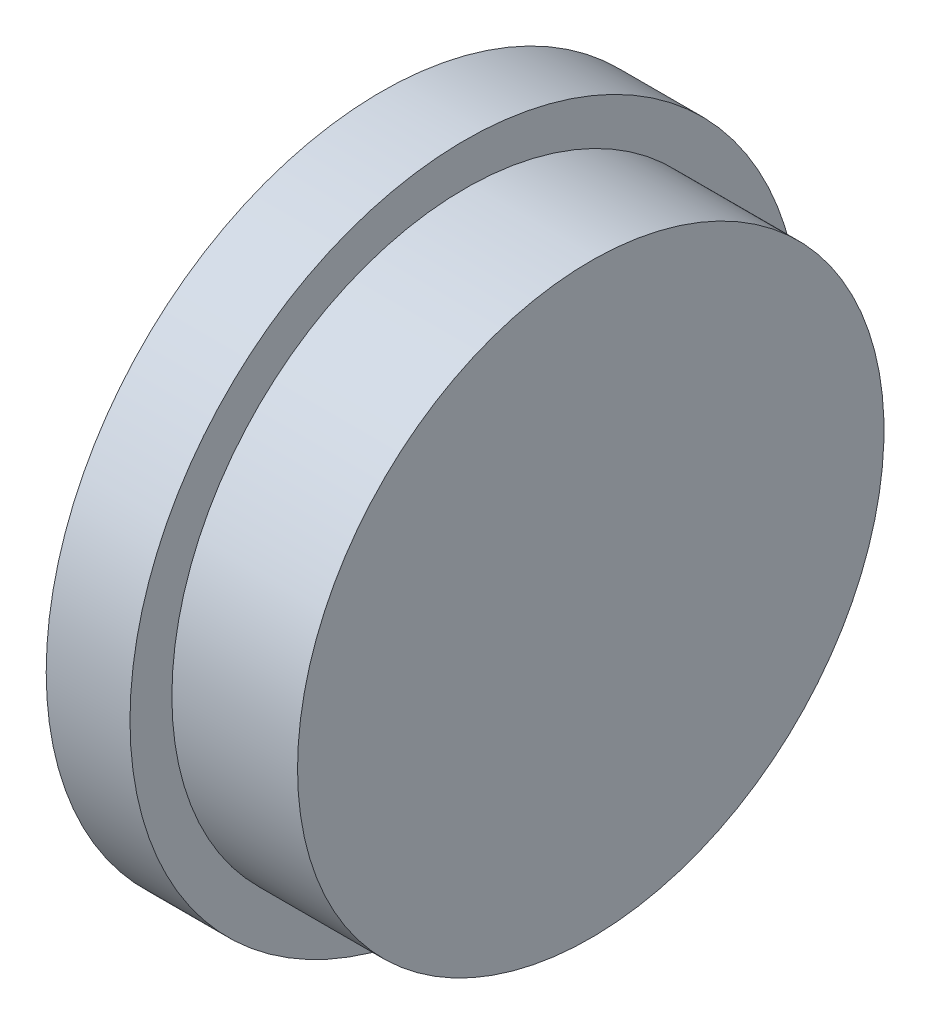
ISO-10303-21;
HEADER;
FILE_DESCRIPTION(('STEP AP214'),'2;1');
FILE_NAME('part.step','',(''),(''),'','','');
FILE_SCHEMA(('AUTOMOTIVE_DESIGN { 1 0 10303 214 1 1 1 1 }'));
ENDSEC;
DATA;
#1=APPLICATION_CONTEXT('core data for automotive mechanical design processes');
#2=APPLICATION_PROTOCOL_DEFINITION('international standard','automotive_design',2000,#1);
#3=PRODUCT_CONTEXT('',#1,'mechanical');
#4=PRODUCT('Part','Part','',(#3));
#5=PRODUCT_RELATED_PRODUCT_CATEGORY('part','',(#4));
#6=PRODUCT_DEFINITION_FORMATION('','',#4);
#7=PRODUCT_DEFINITION_CONTEXT('part definition',#1,'design');
#8=PRODUCT_DEFINITION('design','',#6,#7);
#9=PRODUCT_DEFINITION_SHAPE('','',#8);
#10=(LENGTH_UNIT() NAMED_UNIT(*) SI_UNIT(.MILLI.,.METRE.));
#11=(NAMED_UNIT(*) PLANE_ANGLE_UNIT() SI_UNIT($,.RADIAN.));
#12=(NAMED_UNIT(*) SI_UNIT($,.STERADIAN.) SOLID_ANGLE_UNIT());
#13=UNCERTAINTY_MEASURE_WITH_UNIT(LENGTH_MEASURE(1.E-05),#10,'distance_accuracy_value','');
#14=(GEOMETRIC_REPRESENTATION_CONTEXT(3) GLOBAL_UNCERTAINTY_ASSIGNED_CONTEXT((#13)) GLOBAL_UNIT_ASSIGNED_CONTEXT((#10,
#11,#12)) REPRESENTATION_CONTEXT('',''));
#15=CARTESIAN_POINT('',(0.,0.,0.));
#16=DIRECTION('',(0.,0.,1.));
#17=DIRECTION('',(1.,0.,0.));
#18=AXIS2_PLACEMENT_3D('',#15,#16,#17);
#19=CARTESIAN_POINT('',(15.,0.,0.));
#20=DIRECTION('',(-1.,0.,0.));
#21=DIRECTION('',(0.,0.,1.));
#22=AXIS2_PLACEMENT_3D('',#19,#20,#21);
#23=PLANE('',#22);
#24=CARTESIAN_POINT('',(15.,0.,0.));
#25=DIRECTION('',(-1.,0.,0.));
#26=DIRECTION('',(0.,0.,1.));
#27=AXIS2_PLACEMENT_3D('',#24,#25,#26);
#28=CIRCLE('',#27,21.);
#29=CARTESIAN_POINT('',(15.,0.,21.));
#30=VERTEX_POINT('',#29);
#31=EDGE_CURVE('E64',#30,#30,#28,.T.);
#32=ORIENTED_EDGE('',*,*,#31,.F.);
#33=EDGE_LOOP('',(#32));
#34=FACE_BOUND('',#33,.T.);
#35=ADVANCED_FACE('F37',(#34),#23,.F.);
#36=CARTESIAN_POINT('',(13.,0.,0.));
#37=DIRECTION('',(1.,0.,0.));
#38=DIRECTION('',(0.,0.,-1.));
#39=AXIS2_PLACEMENT_3D('',#36,#37,#38);
#40=PLANE('',#39);
#41=CARTESIAN_POINT('',(13.,0.,0.));
#42=DIRECTION('',(-1.,0.,0.));
#43=DIRECTION('',(0.,0.,1.));
#44=AXIS2_PLACEMENT_3D('',#41,#42,#43);
#45=CIRCLE('',#44,16.);
#46=CARTESIAN_POINT('',(13.,0.,16.));
#47=VERTEX_POINT('',#46);
#48=EDGE_CURVE('E10',#47,#47,#45,.T.);
#49=ORIENTED_EDGE('',*,*,#48,.T.);
#50=EDGE_LOOP('',(#49));
#51=FACE_BOUND('',#50,.T.);
#52=ADVANCED_FACE('F72',(#51),#40,.F.);
#53=CARTESIAN_POINT('',(0.,0.,0.));
#54=DIRECTION('',(-1.,0.,0.));
#55=DIRECTION('',(0.,0.,1.));
#56=AXIS2_PLACEMENT_3D('',#53,#54,#55);
#57=CYLINDRICAL_SURFACE('',#56,16.);
#58=ORIENTED_EDGE('',*,*,#48,.F.);
#59=EDGE_LOOP('',(#58));
#60=FACE_BOUND('',#59,.T.);
#61=CARTESIAN_POINT('',(0.,0.,0.));
#62=DIRECTION('',(-1.,0.,0.));
#63=DIRECTION('',(0.,0.,1.));
#64=AXIS2_PLACEMENT_3D('',#61,#62,#63);
#65=CIRCLE('',#64,16.);
#66=CARTESIAN_POINT('',(0.,0.,16.));
#67=VERTEX_POINT('',#66);
#68=EDGE_CURVE('E44',#67,#67,#65,.T.);
#69=ORIENTED_EDGE('',*,*,#68,.T.);
#70=EDGE_LOOP('',(#69));
#71=FACE_BOUND('',#70,.T.);
#72=ADVANCED_FACE('F76',(#60,#71),#57,.F.);
#73=CARTESIAN_POINT('',(0.,16.,0.));
#74=DIRECTION('',(1.,0.,0.));
#75=DIRECTION('',(0.,0.,-1.));
#76=AXIS2_PLACEMENT_3D('',#73,#74,#75);
#77=PLANE('',#76);
#78=ORIENTED_EDGE('',*,*,#68,.F.);
#79=EDGE_LOOP('',(#78));
#80=FACE_BOUND('',#79,.T.);
#81=CARTESIAN_POINT('',(0.,0.,0.));
#82=DIRECTION('',(-1.,0.,0.));
#83=DIRECTION('',(0.,0.,1.));
#84=AXIS2_PLACEMENT_3D('',#81,#82,#83);
#85=CIRCLE('',#84,24.);
#86=CARTESIAN_POINT('',(0.,0.,24.));
#87=VERTEX_POINT('',#86);
#88=EDGE_CURVE('E49',#87,#87,#85,.T.);
#89=ORIENTED_EDGE('',*,*,#88,.T.);
#90=EDGE_LOOP('',(#89));
#91=FACE_BOUND('',#90,.T.);
#92=ADVANCED_FACE('F80',(#80,#91),#77,.F.);
#93=CARTESIAN_POINT('',(0.,0.,0.));
#94=DIRECTION('',(-1.,0.,0.));
#95=DIRECTION('',(0.,0.,1.));
#96=AXIS2_PLACEMENT_3D('',#93,#94,#95);
#97=CYLINDRICAL_SURFACE('',#96,24.);
#98=ORIENTED_EDGE('',*,*,#88,.F.);
#99=EDGE_LOOP('',(#98));
#100=FACE_BOUND('',#99,.T.);
#101=CARTESIAN_POINT('',(6.,0.,0.));
#102=DIRECTION('',(-1.,0.,0.));
#103=DIRECTION('',(0.,0.,1.));
#104=AXIS2_PLACEMENT_3D('',#101,#102,#103);
#105=CIRCLE('',#104,24.);
#106=CARTESIAN_POINT('',(6.,0.,24.));
#107=VERTEX_POINT('',#106);
#108=EDGE_CURVE('E54',#107,#107,#105,.T.);
#109=ORIENTED_EDGE('',*,*,#108,.T.);
#110=EDGE_LOOP('',(#109));
#111=FACE_BOUND('',#110,.T.);
#112=ADVANCED_FACE('F86',(#100,#111),#97,.T.);
#113=CARTESIAN_POINT('',(6.,24.,0.));
#114=DIRECTION('',(-1.,0.,0.));
#115=DIRECTION('',(0.,0.,1.));
#116=AXIS2_PLACEMENT_3D('',#113,#114,#115);
#117=PLANE('',#116);
#118=ORIENTED_EDGE('',*,*,#108,.F.);
#119=EDGE_LOOP('',(#118));
#120=FACE_BOUND('',#119,.T.);
#121=CARTESIAN_POINT('',(6.,0.,0.));
#122=DIRECTION('',(-1.,0.,0.));
#123=DIRECTION('',(0.,0.,1.));
#124=AXIS2_PLACEMENT_3D('',#121,#122,#123);
#125=CIRCLE('',#124,21.);
#126=CARTESIAN_POINT('',(6.,0.,21.));
#127=VERTEX_POINT('',#126);
#128=EDGE_CURVE('E60',#127,#127,#125,.T.);
#129=ORIENTED_EDGE('',*,*,#128,.T.);
#130=EDGE_LOOP('',(#129));
#131=FACE_BOUND('',#130,.T.);
#132=ADVANCED_FACE('F90',(#120,#131),#117,.F.);
#133=CARTESIAN_POINT('',(0.,0.,0.));
#134=DIRECTION('',(-1.,0.,0.));
#135=DIRECTION('',(0.,0.,1.));
#136=AXIS2_PLACEMENT_3D('',#133,#134,#135);
#137=CYLINDRICAL_SURFACE('',#136,21.);
#138=ORIENTED_EDGE('',*,*,#128,.F.);
#139=EDGE_LOOP('',(#138));
#140=FACE_BOUND('',#139,.T.);
#141=ORIENTED_EDGE('',*,*,#31,.T.);
#142=EDGE_LOOP('',(#141));
#143=FACE_BOUND('',#142,.T.);
#144=ADVANCED_FACE('F69',(#140,#143),#137,.T.);
#145=CLOSED_SHELL('',(#35,#52,#72,#92,#112,#132,#144));
#146=MANIFOLD_SOLID_BREP('B2',#145);
#147=ADVANCED_BREP_SHAPE_REPRESENTATION('',(#18,#146),#14);
#148=SHAPE_DEFINITION_REPRESENTATION(#9,#147);
ENDSEC;
END-ISO-10303-21;
